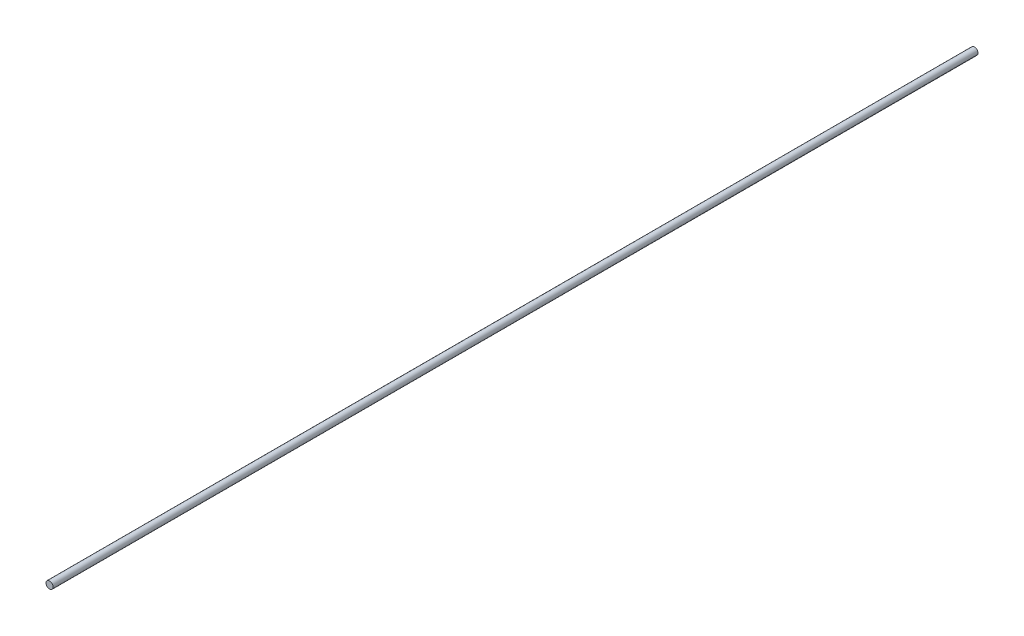
ISO-10303-21;
HEADER;
FILE_DESCRIPTION(('STEP AP214'),'2;1');
FILE_NAME('part.step','',(''),(''),'','','');
FILE_SCHEMA(('AUTOMOTIVE_DESIGN { 1 0 10303 214 1 1 1 1 }'));
ENDSEC;
DATA;
#1=APPLICATION_CONTEXT('core data for automotive mechanical design processes');
#2=APPLICATION_PROTOCOL_DEFINITION('international standard','automotive_design',2000,#1);
#3=PRODUCT_CONTEXT('',#1,'mechanical');
#4=PRODUCT('Part','Part','',(#3));
#5=PRODUCT_RELATED_PRODUCT_CATEGORY('part','',(#4));
#6=PRODUCT_DEFINITION_FORMATION('','',#4);
#7=PRODUCT_DEFINITION_CONTEXT('part definition',#1,'design');
#8=PRODUCT_DEFINITION('design','',#6,#7);
#9=PRODUCT_DEFINITION_SHAPE('','',#8);
#10=(LENGTH_UNIT() NAMED_UNIT(*) SI_UNIT(.MILLI.,.METRE.));
#11=(NAMED_UNIT(*) PLANE_ANGLE_UNIT() SI_UNIT($,.RADIAN.));
#12=(NAMED_UNIT(*) SI_UNIT($,.STERADIAN.) SOLID_ANGLE_UNIT());
#13=UNCERTAINTY_MEASURE_WITH_UNIT(LENGTH_MEASURE(1.E-05),#10,'distance_accuracy_value','');
#14=(GEOMETRIC_REPRESENTATION_CONTEXT(3) GLOBAL_UNCERTAINTY_ASSIGNED_CONTEXT((#13)) GLOBAL_UNIT_ASSIGNED_CONTEXT((#10,
#11,#12)) REPRESENTATION_CONTEXT('',''));
#15=CARTESIAN_POINT('',(0.,0.,0.));
#16=DIRECTION('',(0.,0.,1.));
#17=DIRECTION('',(1.,0.,0.));
#18=AXIS2_PLACEMENT_3D('',#15,#16,#17);
#19=CARTESIAN_POINT('',(0.,0.,652.));
#20=DIRECTION('',(0.,0.,-1.));
#21=DIRECTION('',(-1.,0.,0.));
#22=AXIS2_PLACEMENT_3D('',#19,#20,#21);
#23=CYLINDRICAL_SURFACE('',#22,2.5);
#24=CARTESIAN_POINT('',(0.,0.,652.));
#25=DIRECTION('',(0.,0.,1.));
#26=DIRECTION('',(1.,0.,0.));
#27=AXIS2_PLACEMENT_3D('',#24,#25,#26);
#28=CIRCLE('',#27,2.5);
#29=CARTESIAN_POINT('',(2.5,0.,652.));
#30=VERTEX_POINT('',#29);
#31=EDGE_CURVE('E10',#30,#30,#28,.T.);
#32=ORIENTED_EDGE('',*,*,#31,.F.);
#33=EDGE_LOOP('',(#32));
#34=FACE_BOUND('',#33,.T.);
#35=CARTESIAN_POINT('',(0.,0.,0.));
#36=DIRECTION('',(0.,0.,1.));
#37=DIRECTION('',(1.,0.,0.));
#38=AXIS2_PLACEMENT_3D('',#35,#36,#37);
#39=CIRCLE('',#38,2.5);
#40=CARTESIAN_POINT('',(2.5,0.,0.));
#41=VERTEX_POINT('',#40);
#42=EDGE_CURVE('E40',#41,#41,#39,.T.);
#43=ORIENTED_EDGE('',*,*,#42,.T.);
#44=EDGE_LOOP('',(#43));
#45=FACE_BOUND('',#44,.T.);
#46=ADVANCED_FACE('F37',(#34,#45),#23,.T.);
#47=CARTESIAN_POINT('',(0.,0.,652.));
#48=DIRECTION('',(0.,0.,1.));
#49=DIRECTION('',(1.,0.,0.));
#50=AXIS2_PLACEMENT_3D('',#47,#48,#49);
#51=PLANE('',#50);
#52=ORIENTED_EDGE('',*,*,#31,.T.);
#53=EDGE_LOOP('',(#52));
#54=FACE_BOUND('',#53,.T.);
#55=ADVANCED_FACE('F52',(#54),#51,.T.);
#56=CARTESIAN_POINT('',(0.,0.,0.));
#57=DIRECTION('',(0.,0.,1.));
#58=DIRECTION('',(1.,0.,0.));
#59=AXIS2_PLACEMENT_3D('',#56,#57,#58);
#60=PLANE('',#59);
#61=ORIENTED_EDGE('',*,*,#42,.F.);
#62=EDGE_LOOP('',(#61));
#63=FACE_BOUND('',#62,.T.);
#64=ADVANCED_FACE('F50',(#63),#60,.F.);
#65=CLOSED_SHELL('',(#46,#55,#64));
#66=MANIFOLD_SOLID_BREP('B2',#65);
#67=ADVANCED_BREP_SHAPE_REPRESENTATION('',(#18,#66),#14);
#68=SHAPE_DEFINITION_REPRESENTATION(#9,#67);
ENDSEC;
END-ISO-10303-21;
